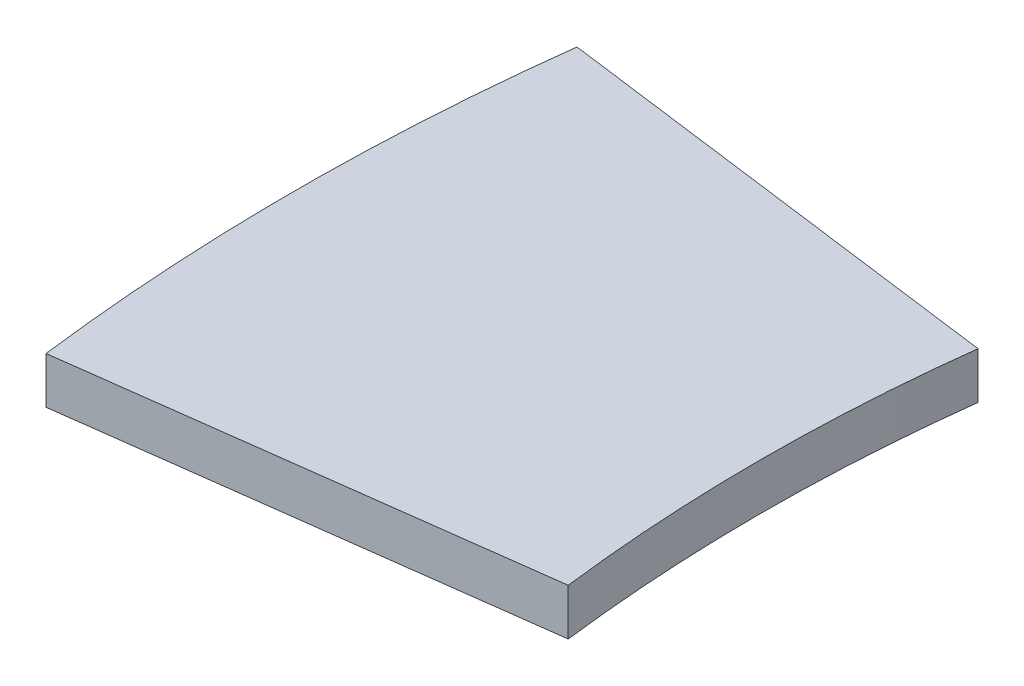
ISO-10303-21;
HEADER;
FILE_DESCRIPTION(('STEP AP214'),'2;1');
FILE_NAME('part.step','',(''),(''),'','','');
FILE_SCHEMA(('AUTOMOTIVE_DESIGN { 1 0 10303 214 1 1 1 1 }'));
ENDSEC;
DATA;
#1=APPLICATION_CONTEXT('core data for automotive mechanical design processes');
#2=APPLICATION_PROTOCOL_DEFINITION('international standard','automotive_design',2000,#1);
#3=PRODUCT_CONTEXT('',#1,'mechanical');
#4=PRODUCT('Part','Part','',(#3));
#5=PRODUCT_RELATED_PRODUCT_CATEGORY('part','',(#4));
#6=PRODUCT_DEFINITION_FORMATION('','',#4);
#7=PRODUCT_DEFINITION_CONTEXT('part definition',#1,'design');
#8=PRODUCT_DEFINITION('design','',#6,#7);
#9=PRODUCT_DEFINITION_SHAPE('','',#8);
#10=(LENGTH_UNIT() NAMED_UNIT(*) SI_UNIT(.MILLI.,.METRE.));
#11=(NAMED_UNIT(*) PLANE_ANGLE_UNIT() SI_UNIT($,.RADIAN.));
#12=(NAMED_UNIT(*) SI_UNIT($,.STERADIAN.) SOLID_ANGLE_UNIT());
#13=UNCERTAINTY_MEASURE_WITH_UNIT(LENGTH_MEASURE(1.E-05),#10,'distance_accuracy_value','');
#14=(GEOMETRIC_REPRESENTATION_CONTEXT(3) GLOBAL_UNCERTAINTY_ASSIGNED_CONTEXT((#13)) GLOBAL_UNIT_ASSIGNED_CONTEXT((#10,
#11,#12)) REPRESENTATION_CONTEXT('',''));
#15=CARTESIAN_POINT('',(0.,0.,0.));
#16=DIRECTION('',(0.,0.,1.));
#17=DIRECTION('',(1.,0.,0.));
#18=AXIS2_PLACEMENT_3D('',#15,#16,#17);
#19=CARTESIAN_POINT('',(408.46830186562,5.,-0.102962144457775));
#20=DIRECTION('',(0.,-1.,0.));
#21=DIRECTION('',(0.,0.,-1.));
#22=AXIS2_PLACEMENT_3D('',#19,#20,#21);
#23=CYLINDRICAL_SURFACE('',#22,460.);
#24=CARTESIAN_POINT('',(408.46830186562,-5.,-0.102962144457775));
#25=DIRECTION('',(0.,1.,0.));
#26=DIRECTION('',(0.,0.,-1.));
#27=AXIS2_PLACEMENT_3D('',#24,#25,#26);
#28=CIRCLE('',#27,460.);
#29=CARTESIAN_POINT('',(-47.9814406303108,-5.,-57.1435842956775));
#30=VERTEX_POINT('',#29);
#31=CARTESIAN_POINT('',(-47.9915861053914,-5.,56.8564152528725));
#32=VERTEX_POINT('',#31);
#33=EDGE_CURVE('E98',#30,#32,#28,.T.);
#34=ORIENTED_EDGE('',*,*,#33,.T.);
#35=DIRECTION('',(0.,-1.,0.));
#36=VECTOR('',#35,1.);
#37=CARTESIAN_POINT('',(-47.9915861053914,5.,56.8564152528725));
#38=LINE('',#37,#36);
#39=CARTESIAN_POINT('',(-47.9915861053914,5.,56.8564152528725));
#40=VERTEX_POINT('',#39);
#41=EDGE_CURVE('E11',#40,#32,#38,.T.);
#42=ORIENTED_EDGE('',*,*,#41,.F.);
#43=CARTESIAN_POINT('',(408.46830186562,5.,-0.102962144457775));
#44=DIRECTION('',(0.,1.,0.));
#45=DIRECTION('',(0.,0.,-1.));
#46=AXIS2_PLACEMENT_3D('',#43,#44,#45);
#47=CIRCLE('',#46,460.);
#48=CARTESIAN_POINT('',(-47.9814406303108,5.,-57.1435842956775));
#49=VERTEX_POINT('',#48);
#50=EDGE_CURVE('E86',#49,#40,#47,.T.);
#51=ORIENTED_EDGE('',*,*,#50,.F.);
#52=DIRECTION('',(0.,-1.,0.));
#53=VECTOR('',#52,1.);
#54=CARTESIAN_POINT('',(-47.9814406303108,5.,-57.1435842956775));
#55=LINE('',#54,#53);
#56=EDGE_CURVE('E94',#49,#30,#55,.T.);
#57=ORIENTED_EDGE('',*,*,#56,.T.);
#58=EDGE_LOOP('',(#34,#42,#51,#57));
#59=FACE_BOUND('',#58,.T.);
#60=ADVANCED_FACE('F35',(#59),#23,.T.);
#61=CARTESIAN_POINT('',(-47.9915861053914,5.,56.8564152528725));
#62=DIRECTION('',(-0.129714431746837,0.,-0.991551393623445));
#63=DIRECTION('',(-0.991551393623445,0.,0.129714431746837));
#64=AXIS2_PLACEMENT_3D('',#61,#62,#63);
#65=PLANE('',#64);
#66=DIRECTION('',(0.991551393623445,0.,-0.129714431746837));
#67=VECTOR('',#66,1.);
#68=CARTESIAN_POINT('',(-47.9915861053914,-5.,56.8564152528725));
#69=LINE('',#68,#67);
#70=CARTESIAN_POINT('',(51.1657866949047,-5.,43.8846799005604));
#71=VERTEX_POINT('',#70);
#72=EDGE_CURVE('E90',#32,#71,#69,.T.);
#73=ORIENTED_EDGE('',*,*,#72,.T.);
#74=DIRECTION('',(0.,-1.,0.));
#75=VECTOR('',#74,1.);
#76=CARTESIAN_POINT('',(51.1657866949047,5.,43.8846799005604));
#77=LINE('',#76,#75);
#78=CARTESIAN_POINT('',(51.1657866949047,5.,43.8846799005604));
#79=VERTEX_POINT('',#78);
#80=EDGE_CURVE('E43',#79,#71,#77,.T.);
#81=ORIENTED_EDGE('',*,*,#80,.F.);
#82=DIRECTION('',(0.991551393623445,0.,-0.129714431746837));
#83=VECTOR('',#82,1.);
#84=CARTESIAN_POINT('',(-47.9915861053914,5.,56.8564152528725));
#85=LINE('',#84,#83);
#86=EDGE_CURVE('E81',#40,#79,#85,.T.);
#87=ORIENTED_EDGE('',*,*,#86,.F.);
#88=ORIENTED_EDGE('',*,*,#41,.T.);
#89=EDGE_LOOP('',(#73,#81,#87,#88));
#90=FACE_BOUND('',#89,.T.);
#91=ADVANCED_FACE('F89',(#90),#65,.F.);
#92=CARTESIAN_POINT('',(408.46830186562,5.,-0.102962144457775));
#93=DIRECTION('',(0.,-1.,0.));
#94=DIRECTION('',(0.,0.,-1.));
#95=AXIS2_PLACEMENT_3D('',#92,#93,#94);
#96=CYLINDRICAL_SURFACE('',#95,360.);
#97=CARTESIAN_POINT('',(408.46830186562,-5.,-0.102962144457775));
#98=DIRECTION('',(0.,-1.,0.));
#99=DIRECTION('',(0.,0.,-1.));
#100=AXIS2_PLACEMENT_3D('',#97,#98,#99);
#101=CIRCLE('',#100,360.);
#102=CARTESIAN_POINT('',(51.1657866949013,-5.,-44.090604189448));
#103=VERTEX_POINT('',#102);
#104=EDGE_CURVE('E68',#71,#103,#101,.T.);
#105=ORIENTED_EDGE('',*,*,#104,.T.);
#106=DIRECTION('',(0.,-1.,0.));
#107=VECTOR('',#106,1.);
#108=CARTESIAN_POINT('',(51.1657866949013,5.,-44.090604189448));
#109=LINE('',#108,#107);
#110=CARTESIAN_POINT('',(51.1657866949013,5.,-44.090604189448));
#111=VERTEX_POINT('',#110);
#112=EDGE_CURVE('E91',#111,#103,#109,.T.);
#113=ORIENTED_EDGE('',*,*,#112,.F.);
#114=CARTESIAN_POINT('',(408.46830186562,5.,-0.102962144457775));
#115=DIRECTION('',(0.,-1.,0.));
#116=DIRECTION('',(0.,0.,-1.));
#117=AXIS2_PLACEMENT_3D('',#114,#115,#116);
#118=CIRCLE('',#117,360.);
#119=EDGE_CURVE('E84',#79,#111,#118,.T.);
#120=ORIENTED_EDGE('',*,*,#119,.F.);
#121=ORIENTED_EDGE('',*,*,#80,.T.);
#122=EDGE_LOOP('',(#105,#113,#120,#121));
#123=FACE_BOUND('',#122,.T.);
#124=ADVANCED_FACE('F92',(#123),#96,.F.);
#125=CARTESIAN_POINT('',(-47.9814406303108,5.,-57.1435842956775));
#126=DIRECTION('',(-0.130526192220052,0.,0.99144486137381));
#127=DIRECTION('',(0.99144486137381,0.,0.130526192220052));
#128=AXIS2_PLACEMENT_3D('',#125,#126,#127);
#129=PLANE('',#128);
#130=DIRECTION('',(-0.99144486137381,0.,-0.130526192220052));
#131=VECTOR('',#130,1.);
#132=CARTESIAN_POINT('',(-47.9814406303108,-5.,-57.1435842956775));
#133=LINE('',#132,#131);
#134=EDGE_CURVE('E74',#103,#30,#133,.T.);
#135=ORIENTED_EDGE('',*,*,#134,.T.);
#136=ORIENTED_EDGE('',*,*,#56,.F.);
#137=DIRECTION('',(-0.99144486137381,0.,-0.130526192220052));
#138=VECTOR('',#137,1.);
#139=CARTESIAN_POINT('',(-47.9814406303108,5.,-57.1435842956775));
#140=LINE('',#139,#138);
#141=EDGE_CURVE('E51',#111,#49,#140,.T.);
#142=ORIENTED_EDGE('',*,*,#141,.F.);
#143=ORIENTED_EDGE('',*,*,#112,.T.);
#144=EDGE_LOOP('',(#135,#136,#142,#143));
#145=FACE_BOUND('',#144,.T.);
#146=ADVANCED_FACE('F105',(#145),#129,.F.);
#147=CARTESIAN_POINT('',(408.46830186562,5.,-0.102962144457775));
#148=DIRECTION('',(0.,-1.,0.));
#149=DIRECTION('',(0.,0.,-1.));
#150=AXIS2_PLACEMENT_3D('',#147,#148,#149);
#151=PLANE('',#150);
#152=ORIENTED_EDGE('',*,*,#50,.T.);
#153=ORIENTED_EDGE('',*,*,#86,.T.);
#154=ORIENTED_EDGE('',*,*,#119,.T.);
#155=ORIENTED_EDGE('',*,*,#141,.T.);
#156=EDGE_LOOP('',(#152,#153,#154,#155));
#157=FACE_BOUND('',#156,.T.);
#158=ADVANCED_FACE('F82',(#157),#151,.F.);
#159=CARTESIAN_POINT('',(408.46830186562,-5.,-0.102962144457775));
#160=DIRECTION('',(0.,-1.,0.));
#161=DIRECTION('',(0.,0.,-1.));
#162=AXIS2_PLACEMENT_3D('',#159,#160,#161);
#163=PLANE('',#162);
#164=ORIENTED_EDGE('',*,*,#33,.F.);
#165=ORIENTED_EDGE('',*,*,#134,.F.);
#166=ORIENTED_EDGE('',*,*,#104,.F.);
#167=ORIENTED_EDGE('',*,*,#72,.F.);
#168=EDGE_LOOP('',(#164,#165,#166,#167));
#169=FACE_BOUND('',#168,.T.);
#170=ADVANCED_FACE('F108',(#169),#163,.T.);
#171=CLOSED_SHELL('',(#60,#91,#124,#146,#158,#170));
#172=MANIFOLD_SOLID_BREP('B2',#171);
#173=ADVANCED_BREP_SHAPE_REPRESENTATION('',(#18,#172),#14);
#174=SHAPE_DEFINITION_REPRESENTATION(#9,#173);
ENDSEC;
END-ISO-10303-21;
